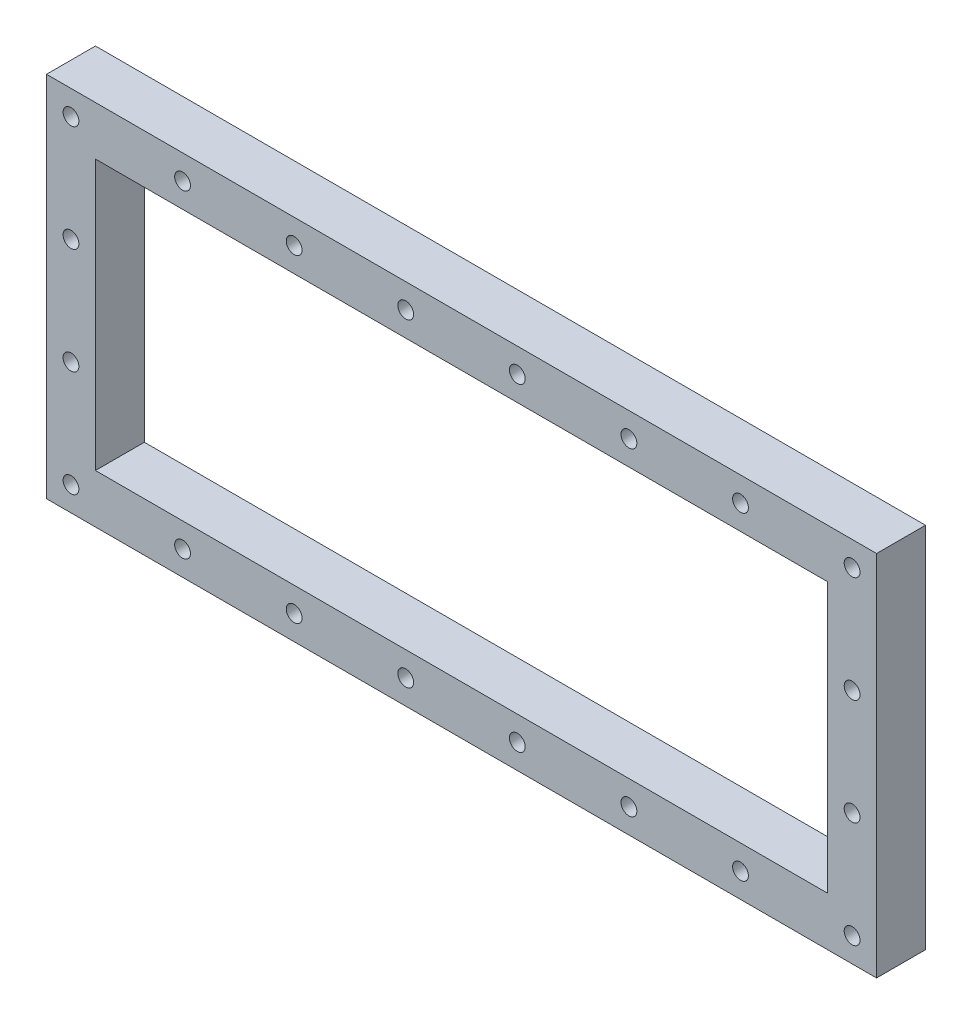
ISO-10303-21;
HEADER;
FILE_DESCRIPTION(('STEP AP214'),'2;1');
FILE_NAME('part.step','',(''),(''),'','','');
FILE_SCHEMA(('AUTOMOTIVE_DESIGN { 1 0 10303 214 1 1 1 1 }'));
ENDSEC;
DATA;
#1=APPLICATION_CONTEXT('core data for automotive mechanical design processes');
#2=APPLICATION_PROTOCOL_DEFINITION('international standard','automotive_design',2000,#1);
#3=PRODUCT_CONTEXT('',#1,'mechanical');
#4=PRODUCT('Part','Part','',(#3));
#5=PRODUCT_RELATED_PRODUCT_CATEGORY('part','',(#4));
#6=PRODUCT_DEFINITION_FORMATION('','',#4);
#7=PRODUCT_DEFINITION_CONTEXT('part definition',#1,'design');
#8=PRODUCT_DEFINITION('design','',#6,#7);
#9=PRODUCT_DEFINITION_SHAPE('','',#8);
#10=(LENGTH_UNIT() NAMED_UNIT(*) SI_UNIT(.MILLI.,.METRE.));
#11=(NAMED_UNIT(*) PLANE_ANGLE_UNIT() SI_UNIT($,.RADIAN.));
#12=(NAMED_UNIT(*) SI_UNIT($,.STERADIAN.) SOLID_ANGLE_UNIT());
#13=UNCERTAINTY_MEASURE_WITH_UNIT(LENGTH_MEASURE(1.E-05),#10,'distance_accuracy_value','');
#14=(GEOMETRIC_REPRESENTATION_CONTEXT(3) GLOBAL_UNCERTAINTY_ASSIGNED_CONTEXT((#13)) GLOBAL_UNIT_ASSIGNED_CONTEXT((#10,
#11,#12)) REPRESENTATION_CONTEXT('',''));
#15=CARTESIAN_POINT('',(0.,0.,0.));
#16=DIRECTION('',(0.,0.,1.));
#17=DIRECTION('',(1.,0.,0.));
#18=AXIS2_PLACEMENT_3D('',#15,#16,#17);
#19=CARTESIAN_POINT('',(0.,17.5,6.35));
#20=DIRECTION('',(0.,1.,0.));
#21=DIRECTION('',(0.,0.,1.));
#22=AXIS2_PLACEMENT_3D('',#19,#20,#21);
#23=PLANE('',#22);
#24=DIRECTION('',(1.,0.,0.));
#25=VECTOR('',#24,1.);
#26=CARTESIAN_POINT('',(0.,17.5,0.));
#27=LINE('',#26,#25);
#28=CARTESIAN_POINT('',(-47.5,17.5,0.));
#29=VERTEX_POINT('',#28);
#30=CARTESIAN_POINT('',(47.5,17.5,0.));
#31=VERTEX_POINT('',#30);
#32=EDGE_CURVE('E243',#29,#31,#27,.T.);
#33=ORIENTED_EDGE('',*,*,#32,.T.);
#34=DIRECTION('',(0.,0.,-1.));
#35=VECTOR('',#34,1.);
#36=CARTESIAN_POINT('',(47.5,17.5,6.35));
#37=LINE('',#36,#35);
#38=CARTESIAN_POINT('',(47.5,17.5,6.35));
#39=VERTEX_POINT('',#38);
#40=EDGE_CURVE('E11',#39,#31,#37,.T.);
#41=ORIENTED_EDGE('',*,*,#40,.F.);
#42=DIRECTION('',(1.,0.,0.));
#43=VECTOR('',#42,1.);
#44=CARTESIAN_POINT('',(0.,17.5,6.35));
#45=LINE('',#44,#43);
#46=CARTESIAN_POINT('',(-47.5,17.5,6.35));
#47=VERTEX_POINT('',#46);
#48=EDGE_CURVE('E126',#47,#39,#45,.T.);
#49=ORIENTED_EDGE('',*,*,#48,.F.);
#50=DIRECTION('',(0.,0.,-1.));
#51=VECTOR('',#50,1.);
#52=CARTESIAN_POINT('',(-47.5,17.5,6.35));
#53=LINE('',#52,#51);
#54=EDGE_CURVE('E65',#47,#29,#53,.T.);
#55=ORIENTED_EDGE('',*,*,#54,.T.);
#56=EDGE_LOOP('',(#33,#41,#49,#55));
#57=FACE_BOUND('',#56,.T.);
#58=ADVANCED_FACE('F45',(#57),#23,.F.);
#59=CARTESIAN_POINT('',(47.5,0.,6.35));
#60=DIRECTION('',(1.,0.,0.));
#61=DIRECTION('',(0.,1.,0.));
#62=AXIS2_PLACEMENT_3D('',#59,#60,#61);
#63=PLANE('',#62);
#64=DIRECTION('',(0.,-1.,0.));
#65=VECTOR('',#64,1.);
#66=CARTESIAN_POINT('',(47.5,0.,0.));
#67=LINE('',#66,#65);
#68=CARTESIAN_POINT('',(47.5,-17.5,0.));
#69=VERTEX_POINT('',#68);
#70=EDGE_CURVE('E133',#31,#69,#67,.T.);
#71=ORIENTED_EDGE('',*,*,#70,.T.);
#72=DIRECTION('',(0.,0.,-1.));
#73=VECTOR('',#72,1.);
#74=CARTESIAN_POINT('',(47.5,-17.5,6.35));
#75=LINE('',#74,#73);
#76=CARTESIAN_POINT('',(47.5,-17.5,6.35));
#77=VERTEX_POINT('',#76);
#78=EDGE_CURVE('E56',#77,#69,#75,.T.);
#79=ORIENTED_EDGE('',*,*,#78,.F.);
#80=DIRECTION('',(0.,-1.,0.));
#81=VECTOR('',#80,1.);
#82=CARTESIAN_POINT('',(47.5,0.,6.35));
#83=LINE('',#82,#81);
#84=EDGE_CURVE('E120',#39,#77,#83,.T.);
#85=ORIENTED_EDGE('',*,*,#84,.F.);
#86=ORIENTED_EDGE('',*,*,#40,.T.);
#87=EDGE_LOOP('',(#71,#79,#85,#86));
#88=FACE_BOUND('',#87,.T.);
#89=ADVANCED_FACE('F132',(#88),#63,.F.);
#90=CARTESIAN_POINT('',(0.,-17.5,6.35));
#91=DIRECTION('',(0.,1.,0.));
#92=DIRECTION('',(0.,0.,1.));
#93=AXIS2_PLACEMENT_3D('',#90,#91,#92);
#94=PLANE('',#93);
#95=DIRECTION('',(1.,0.,0.));
#96=VECTOR('',#95,1.);
#97=CARTESIAN_POINT('',(0.,-17.5,0.));
#98=LINE('',#97,#96);
#99=CARTESIAN_POINT('',(-47.5,-17.5,0.));
#100=VERTEX_POINT('',#99);
#101=EDGE_CURVE('E248',#100,#69,#98,.T.);
#102=ORIENTED_EDGE('',*,*,#101,.F.);
#103=DIRECTION('',(0.,0.,-1.));
#104=VECTOR('',#103,1.);
#105=CARTESIAN_POINT('',(-47.5,-17.5,6.35));
#106=LINE('',#105,#104);
#107=CARTESIAN_POINT('',(-47.5,-17.5,6.35));
#108=VERTEX_POINT('',#107);
#109=EDGE_CURVE('E91',#108,#100,#106,.T.);
#110=ORIENTED_EDGE('',*,*,#109,.F.);
#111=DIRECTION('',(1.,0.,0.));
#112=VECTOR('',#111,1.);
#113=CARTESIAN_POINT('',(0.,-17.5,6.35));
#114=LINE('',#113,#112);
#115=EDGE_CURVE('E125',#108,#77,#114,.T.);
#116=ORIENTED_EDGE('',*,*,#115,.T.);
#117=ORIENTED_EDGE('',*,*,#78,.T.);
#118=EDGE_LOOP('',(#102,#110,#116,#117));
#119=FACE_BOUND('',#118,.T.);
#120=ADVANCED_FACE('F138',(#119),#94,.T.);
#121=CARTESIAN_POINT('',(0.,-23.85,6.35));
#122=DIRECTION('',(0.,1.,0.));
#123=DIRECTION('',(0.,0.,1.));
#124=AXIS2_PLACEMENT_3D('',#121,#122,#123);
#125=PLANE('',#124);
#126=DIRECTION('',(1.,0.,0.));
#127=VECTOR('',#126,1.);
#128=CARTESIAN_POINT('',(0.,-23.85,0.));
#129=LINE('',#128,#127);
#130=CARTESIAN_POINT('',(-53.85,-23.85,0.));
#131=VERTEX_POINT('',#130);
#132=CARTESIAN_POINT('',(53.85,-23.85,0.));
#133=VERTEX_POINT('',#132);
#134=EDGE_CURVE('E227',#131,#133,#129,.T.);
#135=ORIENTED_EDGE('',*,*,#134,.T.);
#136=DIRECTION('',(0.,0.,-1.));
#137=VECTOR('',#136,1.);
#138=CARTESIAN_POINT('',(53.85,-23.85,6.35));
#139=LINE('',#138,#137);
#140=CARTESIAN_POINT('',(53.85,-23.85,6.35));
#141=VERTEX_POINT('',#140);
#142=EDGE_CURVE('E49',#141,#133,#139,.T.);
#143=ORIENTED_EDGE('',*,*,#142,.F.);
#144=DIRECTION('',(1.,0.,0.));
#145=VECTOR('',#144,1.);
#146=CARTESIAN_POINT('',(0.,-23.85,6.35));
#147=LINE('',#146,#145);
#148=CARTESIAN_POINT('',(-53.85,-23.85,6.35));
#149=VERTEX_POINT('',#148);
#150=EDGE_CURVE('E394',#149,#141,#147,.T.);
#151=ORIENTED_EDGE('',*,*,#150,.F.);
#152=DIRECTION('',(0.,0.,-1.));
#153=VECTOR('',#152,1.);
#154=CARTESIAN_POINT('',(-53.85,-23.85,6.35));
#155=LINE('',#154,#153);
#156=EDGE_CURVE('E143',#149,#131,#155,.T.);
#157=ORIENTED_EDGE('',*,*,#156,.T.);
#158=EDGE_LOOP('',(#135,#143,#151,#157));
#159=FACE_BOUND('',#158,.T.);
#160=ADVANCED_FACE('F275',(#159),#125,.F.);
#161=CARTESIAN_POINT('',(53.85,0.,6.35));
#162=DIRECTION('',(-1.,0.,0.));
#163=DIRECTION('',(0.,0.,1.));
#164=AXIS2_PLACEMENT_3D('',#161,#162,#163);
#165=PLANE('',#164);
#166=DIRECTION('',(0.,1.,0.));
#167=VECTOR('',#166,1.);
#168=CARTESIAN_POINT('',(53.85,0.,0.));
#169=LINE('',#168,#167);
#170=CARTESIAN_POINT('',(53.85,23.85,0.));
#171=VERTEX_POINT('',#170);
#172=EDGE_CURVE('E231',#133,#171,#169,.T.);
#173=ORIENTED_EDGE('',*,*,#172,.T.);
#174=DIRECTION('',(0.,0.,-1.));
#175=VECTOR('',#174,1.);
#176=CARTESIAN_POINT('',(53.85,23.85,6.35));
#177=LINE('',#176,#175);
#178=CARTESIAN_POINT('',(53.85,23.85,6.35));
#179=VERTEX_POINT('',#178);
#180=EDGE_CURVE('E264',#179,#171,#177,.T.);
#181=ORIENTED_EDGE('',*,*,#180,.F.);
#182=DIRECTION('',(0.,1.,0.));
#183=VECTOR('',#182,1.);
#184=CARTESIAN_POINT('',(53.85,0.,6.35));
#185=LINE('',#184,#183);
#186=EDGE_CURVE('E104',#141,#179,#185,.T.);
#187=ORIENTED_EDGE('',*,*,#186,.F.);
#188=ORIENTED_EDGE('',*,*,#142,.T.);
#189=EDGE_LOOP('',(#173,#181,#187,#188));
#190=FACE_BOUND('',#189,.T.);
#191=ADVANCED_FACE('F271',(#190),#165,.F.);
#192=CARTESIAN_POINT('',(0.,23.85,6.35));
#193=DIRECTION('',(0.,1.,0.));
#194=DIRECTION('',(0.,0.,1.));
#195=AXIS2_PLACEMENT_3D('',#192,#193,#194);
#196=PLANE('',#195);
#197=DIRECTION('',(1.,0.,0.));
#198=VECTOR('',#197,1.);
#199=CARTESIAN_POINT('',(0.,23.85,0.));
#200=LINE('',#199,#198);
#201=CARTESIAN_POINT('',(-53.85,23.85,0.));
#202=VERTEX_POINT('',#201);
#203=EDGE_CURVE('E235',#202,#171,#200,.T.);
#204=ORIENTED_EDGE('',*,*,#203,.F.);
#205=DIRECTION('',(0.,0.,-1.));
#206=VECTOR('',#205,1.);
#207=CARTESIAN_POINT('',(-53.85,23.85,6.35));
#208=LINE('',#207,#206);
#209=CARTESIAN_POINT('',(-53.85,23.85,6.35));
#210=VERTEX_POINT('',#209);
#211=EDGE_CURVE('E262',#210,#202,#208,.T.);
#212=ORIENTED_EDGE('',*,*,#211,.F.);
#213=DIRECTION('',(1.,0.,0.));
#214=VECTOR('',#213,1.);
#215=CARTESIAN_POINT('',(0.,23.85,6.35));
#216=LINE('',#215,#214);
#217=EDGE_CURVE('E399',#210,#179,#216,.T.);
#218=ORIENTED_EDGE('',*,*,#217,.T.);
#219=ORIENTED_EDGE('',*,*,#180,.T.);
#220=EDGE_LOOP('',(#204,#212,#218,#219));
#221=FACE_BOUND('',#220,.T.);
#222=ADVANCED_FACE('F286',(#221),#196,.T.);
#223=CARTESIAN_POINT('',(-53.85,0.,6.35));
#224=DIRECTION('',(-1.,0.,0.));
#225=DIRECTION('',(0.,0.,1.));
#226=AXIS2_PLACEMENT_3D('',#223,#224,#225);
#227=PLANE('',#226);
#228=DIRECTION('',(0.,1.,0.));
#229=VECTOR('',#228,1.);
#230=CARTESIAN_POINT('',(-53.85,0.,0.));
#231=LINE('',#230,#229);
#232=EDGE_CURVE('E239',#131,#202,#231,.T.);
#233=ORIENTED_EDGE('',*,*,#232,.F.);
#234=ORIENTED_EDGE('',*,*,#156,.F.);
#235=DIRECTION('',(0.,1.,0.));
#236=VECTOR('',#235,1.);
#237=CARTESIAN_POINT('',(-53.85,0.,6.35));
#238=LINE('',#237,#236);
#239=EDGE_CURVE('E284',#149,#210,#238,.T.);
#240=ORIENTED_EDGE('',*,*,#239,.T.);
#241=ORIENTED_EDGE('',*,*,#211,.T.);
#242=EDGE_LOOP('',(#233,#234,#240,#241));
#243=FACE_BOUND('',#242,.T.);
#244=ADVANCED_FACE('F281',(#243),#227,.T.);
#245=CARTESIAN_POINT('',(-50.675,20.675,6.35));
#246=DIRECTION('',(0.,0.,-1.));
#247=DIRECTION('',(-1.,0.,0.));
#248=AXIS2_PLACEMENT_3D('',#245,#246,#247);
#249=CYLINDRICAL_SURFACE('',#248,1.025);
#250=CARTESIAN_POINT('',(-50.675,20.675,6.35));
#251=DIRECTION('',(0.,0.,1.));
#252=DIRECTION('',(1.,0.,0.));
#253=AXIS2_PLACEMENT_3D('',#250,#251,#252);
#254=CIRCLE('',#253,1.025);
#255=CARTESIAN_POINT('',(-49.65,20.675,6.35));
#256=VERTEX_POINT('',#255);
#257=EDGE_CURVE('E393',#256,#256,#254,.T.);
#258=ORIENTED_EDGE('',*,*,#257,.T.);
#259=EDGE_LOOP('',(#258));
#260=FACE_BOUND('',#259,.T.);
#261=CARTESIAN_POINT('',(-50.675,20.675,0.));
#262=DIRECTION('',(0.,0.,1.));
#263=DIRECTION('',(1.,0.,0.));
#264=AXIS2_PLACEMENT_3D('',#261,#262,#263);
#265=CIRCLE('',#264,1.025);
#266=CARTESIAN_POINT('',(-49.65,20.675,0.));
#267=VERTEX_POINT('',#266);
#268=EDGE_CURVE('E223',#267,#267,#265,.T.);
#269=ORIENTED_EDGE('',*,*,#268,.F.);
#270=EDGE_LOOP('',(#269));
#271=FACE_BOUND('',#270,.T.);
#272=ADVANCED_FACE('F293',(#260,#271),#249,.F.);
#273=CARTESIAN_POINT('',(50.675,20.675,6.35));
#274=DIRECTION('',(0.,0.,-1.));
#275=DIRECTION('',(-1.,0.,0.));
#276=AXIS2_PLACEMENT_3D('',#273,#274,#275);
#277=CYLINDRICAL_SURFACE('',#276,1.025);
#278=CARTESIAN_POINT('',(50.675,20.675,6.35));
#279=DIRECTION('',(0.,0.,1.));
#280=DIRECTION('',(1.,0.,0.));
#281=AXIS2_PLACEMENT_3D('',#278,#279,#280);
#282=CIRCLE('',#281,1.025);
#283=CARTESIAN_POINT('',(51.7,20.675,6.35));
#284=VERTEX_POINT('',#283);
#285=EDGE_CURVE('E389',#284,#284,#282,.T.);
#286=ORIENTED_EDGE('',*,*,#285,.T.);
#287=EDGE_LOOP('',(#286));
#288=FACE_BOUND('',#287,.T.);
#289=CARTESIAN_POINT('',(50.675,20.675,0.));
#290=DIRECTION('',(0.,0.,1.));
#291=DIRECTION('',(1.,0.,0.));
#292=AXIS2_PLACEMENT_3D('',#289,#290,#291);
#293=CIRCLE('',#292,1.025);
#294=CARTESIAN_POINT('',(51.7,20.675,0.));
#295=VERTEX_POINT('',#294);
#296=EDGE_CURVE('E219',#295,#295,#293,.T.);
#297=ORIENTED_EDGE('',*,*,#296,.F.);
#298=EDGE_LOOP('',(#297));
#299=FACE_BOUND('',#298,.T.);
#300=ADVANCED_FACE('F490',(#288,#299),#277,.F.);
#301=CARTESIAN_POINT('',(-50.675,-20.675,6.35));
#302=DIRECTION('',(0.,0.,-1.));
#303=DIRECTION('',(-1.,0.,0.));
#304=AXIS2_PLACEMENT_3D('',#301,#302,#303);
#305=CYLINDRICAL_SURFACE('',#304,1.025);
#306=CARTESIAN_POINT('',(-50.675,-20.675,6.35));
#307=DIRECTION('',(0.,0.,1.));
#308=DIRECTION('',(1.,0.,0.));
#309=AXIS2_PLACEMENT_3D('',#306,#307,#308);
#310=CIRCLE('',#309,1.025);
#311=CARTESIAN_POINT('',(-49.65,-20.675,6.35));
#312=VERTEX_POINT('',#311);
#313=EDGE_CURVE('E385',#312,#312,#310,.T.);
#314=ORIENTED_EDGE('',*,*,#313,.T.);
#315=EDGE_LOOP('',(#314));
#316=FACE_BOUND('',#315,.T.);
#317=CARTESIAN_POINT('',(-50.675,-20.675,0.));
#318=DIRECTION('',(0.,0.,1.));
#319=DIRECTION('',(1.,0.,0.));
#320=AXIS2_PLACEMENT_3D('',#317,#318,#319);
#321=CIRCLE('',#320,1.025);
#322=CARTESIAN_POINT('',(-49.65,-20.675,0.));
#323=VERTEX_POINT('',#322);
#324=EDGE_CURVE('E215',#323,#323,#321,.T.);
#325=ORIENTED_EDGE('',*,*,#324,.F.);
#326=EDGE_LOOP('',(#325));
#327=FACE_BOUND('',#326,.T.);
#328=ADVANCED_FACE('F496',(#316,#327),#305,.F.);
#329=CARTESIAN_POINT('',(50.675,-20.675,6.35));
#330=DIRECTION('',(0.,0.,-1.));
#331=DIRECTION('',(-1.,0.,0.));
#332=AXIS2_PLACEMENT_3D('',#329,#330,#331);
#333=CYLINDRICAL_SURFACE('',#332,1.025);
#334=CARTESIAN_POINT('',(50.675,-20.675,6.35));
#335=DIRECTION('',(0.,0.,1.));
#336=DIRECTION('',(1.,0.,0.));
#337=AXIS2_PLACEMENT_3D('',#334,#335,#336);
#338=CIRCLE('',#337,1.025);
#339=CARTESIAN_POINT('',(51.7,-20.675,6.35));
#340=VERTEX_POINT('',#339);
#341=EDGE_CURVE('E381',#340,#340,#338,.T.);
#342=ORIENTED_EDGE('',*,*,#341,.T.);
#343=EDGE_LOOP('',(#342));
#344=FACE_BOUND('',#343,.T.);
#345=CARTESIAN_POINT('',(50.675,-20.675,0.));
#346=DIRECTION('',(0.,0.,1.));
#347=DIRECTION('',(1.,0.,0.));
#348=AXIS2_PLACEMENT_3D('',#345,#346,#347);
#349=CIRCLE('',#348,1.025);
#350=CARTESIAN_POINT('',(51.7,-20.675,0.));
#351=VERTEX_POINT('',#350);
#352=EDGE_CURVE('E211',#351,#351,#349,.T.);
#353=ORIENTED_EDGE('',*,*,#352,.F.);
#354=EDGE_LOOP('',(#353));
#355=FACE_BOUND('',#354,.T.);
#356=ADVANCED_FACE('F503',(#344,#355),#333,.F.);
#357=CARTESIAN_POINT('',(-7.2392857142,20.675,6.35));
#358=DIRECTION('',(0.,0.,-1.));
#359=DIRECTION('',(-1.,0.,0.));
#360=AXIS2_PLACEMENT_3D('',#357,#358,#359);
#361=CYLINDRICAL_SURFACE('',#360,1.025);
#362=CARTESIAN_POINT('',(-7.2392857142,20.675,6.35));
#363=DIRECTION('',(0.,0.,1.));
#364=DIRECTION('',(1.,0.,0.));
#365=AXIS2_PLACEMENT_3D('',#362,#363,#364);
#366=CIRCLE('',#365,1.025);
#367=CARTESIAN_POINT('',(-6.2142857142,20.675,6.35));
#368=VERTEX_POINT('',#367);
#369=EDGE_CURVE('E377',#368,#368,#366,.T.);
#370=ORIENTED_EDGE('',*,*,#369,.T.);
#371=EDGE_LOOP('',(#370));
#372=FACE_BOUND('',#371,.T.);
#373=CARTESIAN_POINT('',(-7.2392857142,20.675,0.));
#374=DIRECTION('',(0.,0.,1.));
#375=DIRECTION('',(1.,0.,0.));
#376=AXIS2_PLACEMENT_3D('',#373,#374,#375);
#377=CIRCLE('',#376,1.025);
#378=CARTESIAN_POINT('',(-6.2142857142,20.675,0.));
#379=VERTEX_POINT('',#378);
#380=EDGE_CURVE('E207',#379,#379,#377,.T.);
#381=ORIENTED_EDGE('',*,*,#380,.F.);
#382=EDGE_LOOP('',(#381));
#383=FACE_BOUND('',#382,.T.);
#384=ADVANCED_FACE('F507',(#372,#383),#361,.F.);
#385=CARTESIAN_POINT('',(-7.2392857142,-20.675,6.35));
#386=DIRECTION('',(0.,0.,-1.));
#387=DIRECTION('',(-1.,0.,0.));
#388=AXIS2_PLACEMENT_3D('',#385,#386,#387);
#389=CYLINDRICAL_SURFACE('',#388,1.025);
#390=CARTESIAN_POINT('',(-7.2392857142,-20.675,6.35));
#391=DIRECTION('',(0.,0.,1.));
#392=DIRECTION('',(1.,0.,0.));
#393=AXIS2_PLACEMENT_3D('',#390,#391,#392);
#394=CIRCLE('',#393,1.025);
#395=CARTESIAN_POINT('',(-6.2142857142,-20.675,6.35));
#396=VERTEX_POINT('',#395);
#397=EDGE_CURVE('E373',#396,#396,#394,.T.);
#398=ORIENTED_EDGE('',*,*,#397,.T.);
#399=EDGE_LOOP('',(#398));
#400=FACE_BOUND('',#399,.T.);
#401=CARTESIAN_POINT('',(-7.2392857142,-20.675,0.));
#402=DIRECTION('',(0.,0.,1.));
#403=DIRECTION('',(1.,0.,0.));
#404=AXIS2_PLACEMENT_3D('',#401,#402,#403);
#405=CIRCLE('',#404,1.025);
#406=CARTESIAN_POINT('',(-6.2142857142,-20.675,0.));
#407=VERTEX_POINT('',#406);
#408=EDGE_CURVE('E203',#407,#407,#405,.T.);
#409=ORIENTED_EDGE('',*,*,#408,.F.);
#410=EDGE_LOOP('',(#409));
#411=FACE_BOUND('',#410,.T.);
#412=ADVANCED_FACE('F511',(#400,#411),#389,.F.);
#413=CARTESIAN_POINT('',(-36.1964285714,20.675,6.35));
#414=DIRECTION('',(0.,0.,-1.));
#415=DIRECTION('',(-1.,0.,0.));
#416=AXIS2_PLACEMENT_3D('',#413,#414,#415);
#417=CYLINDRICAL_SURFACE('',#416,1.025);
#418=CARTESIAN_POINT('',(-36.1964285714,20.675,6.35));
#419=DIRECTION('',(0.,0.,1.));
#420=DIRECTION('',(1.,0.,0.));
#421=AXIS2_PLACEMENT_3D('',#418,#419,#420);
#422=CIRCLE('',#421,1.025);
#423=CARTESIAN_POINT('',(-35.1714285714,20.675,6.35));
#424=VERTEX_POINT('',#423);
#425=EDGE_CURVE('E369',#424,#424,#422,.T.);
#426=ORIENTED_EDGE('',*,*,#425,.T.);
#427=EDGE_LOOP('',(#426));
#428=FACE_BOUND('',#427,.T.);
#429=CARTESIAN_POINT('',(-36.1964285714,20.675,0.));
#430=DIRECTION('',(0.,0.,1.));
#431=DIRECTION('',(1.,0.,0.));
#432=AXIS2_PLACEMENT_3D('',#429,#430,#431);
#433=CIRCLE('',#432,1.025);
#434=CARTESIAN_POINT('',(-35.1714285714,20.675,0.));
#435=VERTEX_POINT('',#434);
#436=EDGE_CURVE('E199',#435,#435,#433,.T.);
#437=ORIENTED_EDGE('',*,*,#436,.F.);
#438=EDGE_LOOP('',(#437));
#439=FACE_BOUND('',#438,.T.);
#440=ADVANCED_FACE('F515',(#428,#439),#417,.F.);
#441=CARTESIAN_POINT('',(-21.7178571428,20.675,6.35));
#442=DIRECTION('',(0.,0.,-1.));
#443=DIRECTION('',(-1.,0.,0.));
#444=AXIS2_PLACEMENT_3D('',#441,#442,#443);
#445=CYLINDRICAL_SURFACE('',#444,1.025);
#446=CARTESIAN_POINT('',(-21.7178571428,20.675,6.35));
#447=DIRECTION('',(0.,0.,1.));
#448=DIRECTION('',(1.,0.,0.));
#449=AXIS2_PLACEMENT_3D('',#446,#447,#448);
#450=CIRCLE('',#449,1.025);
#451=CARTESIAN_POINT('',(-20.6928571428,20.675,6.35));
#452=VERTEX_POINT('',#451);
#453=EDGE_CURVE('E365',#452,#452,#450,.T.);
#454=ORIENTED_EDGE('',*,*,#453,.T.);
#455=EDGE_LOOP('',(#454));
#456=FACE_BOUND('',#455,.T.);
#457=CARTESIAN_POINT('',(-21.7178571428,20.675,0.));
#458=DIRECTION('',(0.,0.,1.));
#459=DIRECTION('',(1.,0.,0.));
#460=AXIS2_PLACEMENT_3D('',#457,#458,#459);
#461=CIRCLE('',#460,1.025);
#462=CARTESIAN_POINT('',(-20.6928571428,20.675,0.));
#463=VERTEX_POINT('',#462);
#464=EDGE_CURVE('E195',#463,#463,#461,.T.);
#465=ORIENTED_EDGE('',*,*,#464,.F.);
#466=EDGE_LOOP('',(#465));
#467=FACE_BOUND('',#466,.T.);
#468=ADVANCED_FACE('F519',(#456,#467),#445,.F.);
#469=CARTESIAN_POINT('',(7.2392857144,20.675,6.35));
#470=DIRECTION('',(0.,0.,-1.));
#471=DIRECTION('',(-1.,0.,0.));
#472=AXIS2_PLACEMENT_3D('',#469,#470,#471);
#473=CYLINDRICAL_SURFACE('',#472,1.025);
#474=CARTESIAN_POINT('',(7.2392857144,20.675,6.35));
#475=DIRECTION('',(0.,0.,1.));
#476=DIRECTION('',(1.,0.,0.));
#477=AXIS2_PLACEMENT_3D('',#474,#475,#476);
#478=CIRCLE('',#477,1.025);
#479=CARTESIAN_POINT('',(8.2642857144,20.675,6.35));
#480=VERTEX_POINT('',#479);
#481=EDGE_CURVE('E361',#480,#480,#478,.T.);
#482=ORIENTED_EDGE('',*,*,#481,.T.);
#483=EDGE_LOOP('',(#482));
#484=FACE_BOUND('',#483,.T.);
#485=CARTESIAN_POINT('',(7.2392857144,20.675,0.));
#486=DIRECTION('',(0.,0.,1.));
#487=DIRECTION('',(1.,0.,0.));
#488=AXIS2_PLACEMENT_3D('',#485,#486,#487);
#489=CIRCLE('',#488,1.025);
#490=CARTESIAN_POINT('',(8.2642857144,20.675,0.));
#491=VERTEX_POINT('',#490);
#492=EDGE_CURVE('E191',#491,#491,#489,.T.);
#493=ORIENTED_EDGE('',*,*,#492,.F.);
#494=EDGE_LOOP('',(#493));
#495=FACE_BOUND('',#494,.T.);
#496=ADVANCED_FACE('F523',(#484,#495),#473,.F.);
#497=CARTESIAN_POINT('',(21.717857143,20.675,6.35));
#498=DIRECTION('',(0.,0.,-1.));
#499=DIRECTION('',(-1.,0.,0.));
#500=AXIS2_PLACEMENT_3D('',#497,#498,#499);
#501=CYLINDRICAL_SURFACE('',#500,1.025);
#502=CARTESIAN_POINT('',(21.717857143,20.675,6.35));
#503=DIRECTION('',(0.,0.,1.));
#504=DIRECTION('',(1.,0.,0.));
#505=AXIS2_PLACEMENT_3D('',#502,#503,#504);
#506=CIRCLE('',#505,1.025);
#507=CARTESIAN_POINT('',(22.742857143,20.675,6.35));
#508=VERTEX_POINT('',#507);
#509=EDGE_CURVE('E357',#508,#508,#506,.T.);
#510=ORIENTED_EDGE('',*,*,#509,.T.);
#511=EDGE_LOOP('',(#510));
#512=FACE_BOUND('',#511,.T.);
#513=CARTESIAN_POINT('',(21.717857143,20.675,0.));
#514=DIRECTION('',(0.,0.,1.));
#515=DIRECTION('',(1.,0.,0.));
#516=AXIS2_PLACEMENT_3D('',#513,#514,#515);
#517=CIRCLE('',#516,1.025);
#518=CARTESIAN_POINT('',(22.742857143,20.675,0.));
#519=VERTEX_POINT('',#518);
#520=EDGE_CURVE('E187',#519,#519,#517,.T.);
#521=ORIENTED_EDGE('',*,*,#520,.F.);
#522=EDGE_LOOP('',(#521));
#523=FACE_BOUND('',#522,.T.);
#524=ADVANCED_FACE('F527',(#512,#523),#501,.F.);
#525=CARTESIAN_POINT('',(-50.675,6.89166670000001,6.35));
#526=DIRECTION('',(0.,0.,-1.));
#527=DIRECTION('',(-1.,0.,0.));
#528=AXIS2_PLACEMENT_3D('',#525,#526,#527);
#529=CYLINDRICAL_SURFACE('',#528,1.025);
#530=CARTESIAN_POINT('',(-50.675,6.89166670000001,6.35));
#531=DIRECTION('',(0.,0.,1.));
#532=DIRECTION('',(1.,0.,0.));
#533=AXIS2_PLACEMENT_3D('',#530,#531,#532);
#534=CIRCLE('',#533,1.025);
#535=CARTESIAN_POINT('',(-49.65,6.89166670000001,6.35));
#536=VERTEX_POINT('',#535);
#537=EDGE_CURVE('E353',#536,#536,#534,.T.);
#538=ORIENTED_EDGE('',*,*,#537,.T.);
#539=EDGE_LOOP('',(#538));
#540=FACE_BOUND('',#539,.T.);
#541=CARTESIAN_POINT('',(-50.675,6.89166670000001,0.));
#542=DIRECTION('',(0.,0.,1.));
#543=DIRECTION('',(1.,0.,0.));
#544=AXIS2_PLACEMENT_3D('',#541,#542,#543);
#545=CIRCLE('',#544,1.025);
#546=CARTESIAN_POINT('',(-49.65,6.89166670000001,0.));
#547=VERTEX_POINT('',#546);
#548=EDGE_CURVE('E183',#547,#547,#545,.T.);
#549=ORIENTED_EDGE('',*,*,#548,.F.);
#550=EDGE_LOOP('',(#549));
#551=FACE_BOUND('',#550,.T.);
#552=ADVANCED_FACE('F531',(#540,#551),#529,.F.);
#553=CARTESIAN_POINT('',(-50.675,-6.8916667,6.35));
#554=DIRECTION('',(0.,0.,-1.));
#555=DIRECTION('',(-1.,0.,0.));
#556=AXIS2_PLACEMENT_3D('',#553,#554,#555);
#557=CYLINDRICAL_SURFACE('',#556,1.025);
#558=CARTESIAN_POINT('',(-50.675,-6.8916667,6.35));
#559=DIRECTION('',(0.,0.,1.));
#560=DIRECTION('',(1.,0.,0.));
#561=AXIS2_PLACEMENT_3D('',#558,#559,#560);
#562=CIRCLE('',#561,1.025);
#563=CARTESIAN_POINT('',(-49.65,-6.8916667,6.35));
#564=VERTEX_POINT('',#563);
#565=EDGE_CURVE('E349',#564,#564,#562,.T.);
#566=ORIENTED_EDGE('',*,*,#565,.T.);
#567=EDGE_LOOP('',(#566));
#568=FACE_BOUND('',#567,.T.);
#569=CARTESIAN_POINT('',(-50.675,-6.8916667,0.));
#570=DIRECTION('',(0.,0.,1.));
#571=DIRECTION('',(1.,0.,0.));
#572=AXIS2_PLACEMENT_3D('',#569,#570,#571);
#573=CIRCLE('',#572,1.025);
#574=CARTESIAN_POINT('',(-49.65,-6.8916667,0.));
#575=VERTEX_POINT('',#574);
#576=EDGE_CURVE('E179',#575,#575,#573,.T.);
#577=ORIENTED_EDGE('',*,*,#576,.F.);
#578=EDGE_LOOP('',(#577));
#579=FACE_BOUND('',#578,.T.);
#580=ADVANCED_FACE('F535',(#568,#579),#557,.F.);
#581=CARTESIAN_POINT('',(50.675,6.89166670000002,6.35));
#582=DIRECTION('',(0.,0.,-1.));
#583=DIRECTION('',(-1.,0.,0.));
#584=AXIS2_PLACEMENT_3D('',#581,#582,#583);
#585=CYLINDRICAL_SURFACE('',#584,1.025);
#586=CARTESIAN_POINT('',(50.675,6.89166670000002,6.35));
#587=DIRECTION('',(0.,0.,1.));
#588=DIRECTION('',(1.,0.,0.));
#589=AXIS2_PLACEMENT_3D('',#586,#587,#588);
#590=CIRCLE('',#589,1.025);
#591=CARTESIAN_POINT('',(51.7,6.89166670000002,6.35));
#592=VERTEX_POINT('',#591);
#593=EDGE_CURVE('E345',#592,#592,#590,.T.);
#594=ORIENTED_EDGE('',*,*,#593,.T.);
#595=EDGE_LOOP('',(#594));
#596=FACE_BOUND('',#595,.T.);
#597=CARTESIAN_POINT('',(50.675,6.89166670000002,0.));
#598=DIRECTION('',(0.,0.,1.));
#599=DIRECTION('',(1.,0.,0.));
#600=AXIS2_PLACEMENT_3D('',#597,#598,#599);
#601=CIRCLE('',#600,1.025);
#602=CARTESIAN_POINT('',(51.7,6.89166670000002,0.));
#603=VERTEX_POINT('',#602);
#604=EDGE_CURVE('E175',#603,#603,#601,.T.);
#605=ORIENTED_EDGE('',*,*,#604,.F.);
#606=EDGE_LOOP('',(#605));
#607=FACE_BOUND('',#606,.T.);
#608=ADVANCED_FACE('F539',(#596,#607),#585,.F.);
#609=CARTESIAN_POINT('',(50.675,-6.89166669999998,6.35));
#610=DIRECTION('',(0.,0.,-1.));
#611=DIRECTION('',(-1.,0.,0.));
#612=AXIS2_PLACEMENT_3D('',#609,#610,#611);
#613=CYLINDRICAL_SURFACE('',#612,1.025);
#614=CARTESIAN_POINT('',(50.675,-6.89166669999998,6.35));
#615=DIRECTION('',(0.,0.,1.));
#616=DIRECTION('',(1.,0.,0.));
#617=AXIS2_PLACEMENT_3D('',#614,#615,#616);
#618=CIRCLE('',#617,1.025);
#619=CARTESIAN_POINT('',(51.7,-6.89166669999998,6.35));
#620=VERTEX_POINT('',#619);
#621=EDGE_CURVE('E341',#620,#620,#618,.T.);
#622=ORIENTED_EDGE('',*,*,#621,.T.);
#623=EDGE_LOOP('',(#622));
#624=FACE_BOUND('',#623,.T.);
#625=CARTESIAN_POINT('',(50.675,-6.89166669999998,0.));
#626=DIRECTION('',(0.,0.,1.));
#627=DIRECTION('',(1.,0.,0.));
#628=AXIS2_PLACEMENT_3D('',#625,#626,#627);
#629=CIRCLE('',#628,1.025);
#630=CARTESIAN_POINT('',(51.7,-6.89166669999998,0.));
#631=VERTEX_POINT('',#630);
#632=EDGE_CURVE('E171',#631,#631,#629,.T.);
#633=ORIENTED_EDGE('',*,*,#632,.F.);
#634=EDGE_LOOP('',(#633));
#635=FACE_BOUND('',#634,.T.);
#636=ADVANCED_FACE('F543',(#624,#635),#613,.F.);
#637=CARTESIAN_POINT('',(7.2392857144,-20.675,6.35));
#638=DIRECTION('',(0.,0.,-1.));
#639=DIRECTION('',(-1.,0.,0.));
#640=AXIS2_PLACEMENT_3D('',#637,#638,#639);
#641=CYLINDRICAL_SURFACE('',#640,1.025);
#642=CARTESIAN_POINT('',(7.2392857144,-20.675,6.35));
#643=DIRECTION('',(0.,0.,1.));
#644=DIRECTION('',(1.,0.,0.));
#645=AXIS2_PLACEMENT_3D('',#642,#643,#644);
#646=CIRCLE('',#645,1.025);
#647=CARTESIAN_POINT('',(8.2642857144,-20.675,6.35));
#648=VERTEX_POINT('',#647);
#649=EDGE_CURVE('E337',#648,#648,#646,.T.);
#650=ORIENTED_EDGE('',*,*,#649,.T.);
#651=EDGE_LOOP('',(#650));
#652=FACE_BOUND('',#651,.T.);
#653=CARTESIAN_POINT('',(7.2392857144,-20.675,0.));
#654=DIRECTION('',(0.,0.,1.));
#655=DIRECTION('',(1.,0.,0.));
#656=AXIS2_PLACEMENT_3D('',#653,#654,#655);
#657=CIRCLE('',#656,1.025);
#658=CARTESIAN_POINT('',(8.2642857144,-20.675,0.));
#659=VERTEX_POINT('',#658);
#660=EDGE_CURVE('E167',#659,#659,#657,.T.);
#661=ORIENTED_EDGE('',*,*,#660,.F.);
#662=EDGE_LOOP('',(#661));
#663=FACE_BOUND('',#662,.T.);
#664=ADVANCED_FACE('F547',(#652,#663),#641,.F.);
#665=CARTESIAN_POINT('',(21.717857143,-20.675,6.35));
#666=DIRECTION('',(0.,0.,-1.));
#667=DIRECTION('',(-1.,0.,0.));
#668=AXIS2_PLACEMENT_3D('',#665,#666,#667);
#669=CYLINDRICAL_SURFACE('',#668,1.025);
#670=CARTESIAN_POINT('',(21.717857143,-20.675,6.35));
#671=DIRECTION('',(0.,0.,1.));
#672=DIRECTION('',(1.,0.,0.));
#673=AXIS2_PLACEMENT_3D('',#670,#671,#672);
#674=CIRCLE('',#673,1.025);
#675=CARTESIAN_POINT('',(22.742857143,-20.675,6.35));
#676=VERTEX_POINT('',#675);
#677=EDGE_CURVE('E333',#676,#676,#674,.T.);
#678=ORIENTED_EDGE('',*,*,#677,.T.);
#679=EDGE_LOOP('',(#678));
#680=FACE_BOUND('',#679,.T.);
#681=CARTESIAN_POINT('',(21.717857143,-20.675,0.));
#682=DIRECTION('',(0.,0.,1.));
#683=DIRECTION('',(1.,0.,0.));
#684=AXIS2_PLACEMENT_3D('',#681,#682,#683);
#685=CIRCLE('',#684,1.025);
#686=CARTESIAN_POINT('',(22.742857143,-20.675,0.));
#687=VERTEX_POINT('',#686);
#688=EDGE_CURVE('E163',#687,#687,#685,.T.);
#689=ORIENTED_EDGE('',*,*,#688,.F.);
#690=EDGE_LOOP('',(#689));
#691=FACE_BOUND('',#690,.T.);
#692=ADVANCED_FACE('F551',(#680,#691),#669,.F.);
#693=CARTESIAN_POINT('',(-21.7178571428,-20.675,6.35));
#694=DIRECTION('',(0.,0.,-1.));
#695=DIRECTION('',(-1.,0.,0.));
#696=AXIS2_PLACEMENT_3D('',#693,#694,#695);
#697=CYLINDRICAL_SURFACE('',#696,1.02499999999999);
#698=CARTESIAN_POINT('',(-21.7178571428,-20.675,6.35));
#699=DIRECTION('',(0.,0.,1.));
#700=DIRECTION('',(1.,0.,0.));
#701=AXIS2_PLACEMENT_3D('',#698,#699,#700);
#702=CIRCLE('',#701,1.02499999999999);
#703=CARTESIAN_POINT('',(-20.6928571428,-20.675,6.35));
#704=VERTEX_POINT('',#703);
#705=EDGE_CURVE('E329',#704,#704,#702,.T.);
#706=ORIENTED_EDGE('',*,*,#705,.T.);
#707=EDGE_LOOP('',(#706));
#708=FACE_BOUND('',#707,.T.);
#709=CARTESIAN_POINT('',(-21.7178571428,-20.675,0.));
#710=DIRECTION('',(0.,0.,1.));
#711=DIRECTION('',(1.,0.,0.));
#712=AXIS2_PLACEMENT_3D('',#709,#710,#711);
#713=CIRCLE('',#712,1.02499999999999);
#714=CARTESIAN_POINT('',(-20.6928571428,-20.675,0.));
#715=VERTEX_POINT('',#714);
#716=EDGE_CURVE('E159',#715,#715,#713,.T.);
#717=ORIENTED_EDGE('',*,*,#716,.F.);
#718=EDGE_LOOP('',(#717));
#719=FACE_BOUND('',#718,.T.);
#720=ADVANCED_FACE('F555',(#708,#719),#697,.F.);
#721=CARTESIAN_POINT('',(-36.1964285714,-20.675,6.35));
#722=DIRECTION('',(0.,0.,-1.));
#723=DIRECTION('',(-1.,0.,0.));
#724=AXIS2_PLACEMENT_3D('',#721,#722,#723);
#725=CYLINDRICAL_SURFACE('',#724,1.025);
#726=CARTESIAN_POINT('',(-36.1964285714,-20.675,6.35));
#727=DIRECTION('',(0.,0.,1.));
#728=DIRECTION('',(1.,0.,0.));
#729=AXIS2_PLACEMENT_3D('',#726,#727,#728);
#730=CIRCLE('',#729,1.025);
#731=CARTESIAN_POINT('',(-35.1714285714,-20.675,6.35));
#732=VERTEX_POINT('',#731);
#733=EDGE_CURVE('E325',#732,#732,#730,.T.);
#734=ORIENTED_EDGE('',*,*,#733,.T.);
#735=EDGE_LOOP('',(#734));
#736=FACE_BOUND('',#735,.T.);
#737=CARTESIAN_POINT('',(-36.1964285714,-20.675,0.));
#738=DIRECTION('',(0.,0.,1.));
#739=DIRECTION('',(1.,0.,0.));
#740=AXIS2_PLACEMENT_3D('',#737,#738,#739);
#741=CIRCLE('',#740,1.025);
#742=CARTESIAN_POINT('',(-35.1714285714,-20.675,0.));
#743=VERTEX_POINT('',#742);
#744=EDGE_CURVE('E155',#743,#743,#741,.T.);
#745=ORIENTED_EDGE('',*,*,#744,.F.);
#746=EDGE_LOOP('',(#745));
#747=FACE_BOUND('',#746,.T.);
#748=ADVANCED_FACE('F559',(#736,#747),#725,.F.);
#749=CARTESIAN_POINT('',(36.1964285716,20.675,6.35));
#750=DIRECTION('',(0.,0.,-1.));
#751=DIRECTION('',(-1.,0.,0.));
#752=AXIS2_PLACEMENT_3D('',#749,#750,#751);
#753=CYLINDRICAL_SURFACE('',#752,1.025);
#754=CARTESIAN_POINT('',(36.1964285716,20.675,6.35));
#755=DIRECTION('',(0.,0.,1.));
#756=DIRECTION('',(1.,0.,0.));
#757=AXIS2_PLACEMENT_3D('',#754,#755,#756);
#758=CIRCLE('',#757,1.025);
#759=CARTESIAN_POINT('',(37.2214285716,20.675,6.35));
#760=VERTEX_POINT('',#759);
#761=EDGE_CURVE('E321',#760,#760,#758,.T.);
#762=ORIENTED_EDGE('',*,*,#761,.T.);
#763=EDGE_LOOP('',(#762));
#764=FACE_BOUND('',#763,.T.);
#765=CARTESIAN_POINT('',(36.1964285716,20.675,0.));
#766=DIRECTION('',(0.,0.,1.));
#767=DIRECTION('',(1.,0.,0.));
#768=AXIS2_PLACEMENT_3D('',#765,#766,#767);
#769=CIRCLE('',#768,1.025);
#770=CARTESIAN_POINT('',(37.2214285716,20.675,0.));
#771=VERTEX_POINT('',#770);
#772=EDGE_CURVE('E151',#771,#771,#769,.T.);
#773=ORIENTED_EDGE('',*,*,#772,.F.);
#774=EDGE_LOOP('',(#773));
#775=FACE_BOUND('',#774,.T.);
#776=ADVANCED_FACE('F448',(#764,#775),#753,.F.);
#777=CARTESIAN_POINT('',(36.1964285716,-20.675,6.35));
#778=DIRECTION('',(0.,0.,-1.));
#779=DIRECTION('',(-1.,0.,0.));
#780=AXIS2_PLACEMENT_3D('',#777,#778,#779);
#781=CYLINDRICAL_SURFACE('',#780,1.025);
#782=CARTESIAN_POINT('',(36.1964285716,-20.675,6.35));
#783=DIRECTION('',(0.,0.,1.));
#784=DIRECTION('',(1.,0.,0.));
#785=AXIS2_PLACEMENT_3D('',#782,#783,#784);
#786=CIRCLE('',#785,1.025);
#787=CARTESIAN_POINT('',(37.2214285716,-20.675,6.35));
#788=VERTEX_POINT('',#787);
#789=EDGE_CURVE('E255',#788,#788,#786,.T.);
#790=ORIENTED_EDGE('',*,*,#789,.T.);
#791=EDGE_LOOP('',(#790));
#792=FACE_BOUND('',#791,.T.);
#793=CARTESIAN_POINT('',(36.1964285716,-20.675,0.));
#794=DIRECTION('',(0.,0.,1.));
#795=DIRECTION('',(1.,0.,0.));
#796=AXIS2_PLACEMENT_3D('',#793,#794,#795);
#797=CIRCLE('',#796,1.025);
#798=CARTESIAN_POINT('',(37.2214285716,-20.675,0.));
#799=VERTEX_POINT('',#798);
#800=EDGE_CURVE('E147',#799,#799,#797,.T.);
#801=ORIENTED_EDGE('',*,*,#800,.F.);
#802=EDGE_LOOP('',(#801));
#803=FACE_BOUND('',#802,.T.);
#804=ADVANCED_FACE('F47',(#792,#803),#781,.F.);
#805=CARTESIAN_POINT('',(-47.5,0.,6.35));
#806=DIRECTION('',(1.,0.,0.));
#807=DIRECTION('',(0.,1.,0.));
#808=AXIS2_PLACEMENT_3D('',#805,#806,#807);
#809=PLANE('',#808);
#810=DIRECTION('',(0.,-1.,0.));
#811=VECTOR('',#810,1.);
#812=CARTESIAN_POINT('',(-47.5,0.,0.));
#813=LINE('',#812,#811);
#814=EDGE_CURVE('E251',#29,#100,#813,.T.);
#815=ORIENTED_EDGE('',*,*,#814,.F.);
#816=ORIENTED_EDGE('',*,*,#54,.F.);
#817=DIRECTION('',(0.,-1.,0.));
#818=VECTOR('',#817,1.);
#819=CARTESIAN_POINT('',(-47.5,0.,6.35));
#820=LINE('',#819,#818);
#821=EDGE_CURVE('E140',#47,#108,#820,.T.);
#822=ORIENTED_EDGE('',*,*,#821,.T.);
#823=ORIENTED_EDGE('',*,*,#109,.T.);
#824=EDGE_LOOP('',(#815,#816,#822,#823));
#825=FACE_BOUND('',#824,.T.);
#826=ADVANCED_FACE('F305',(#825),#809,.T.);
#827=CARTESIAN_POINT('',(0.,0.,6.35));
#828=DIRECTION('',(0.,0.,1.));
#829=DIRECTION('',(1.,0.,0.));
#830=AXIS2_PLACEMENT_3D('',#827,#828,#829);
#831=PLANE('',#830);
#832=ORIENTED_EDGE('',*,*,#789,.F.);
#833=EDGE_LOOP('',(#832));
#834=FACE_BOUND('',#833,.T.);
#835=ORIENTED_EDGE('',*,*,#761,.F.);
#836=EDGE_LOOP('',(#835));
#837=FACE_BOUND('',#836,.T.);
#838=ORIENTED_EDGE('',*,*,#733,.F.);
#839=EDGE_LOOP('',(#838));
#840=FACE_BOUND('',#839,.T.);
#841=ORIENTED_EDGE('',*,*,#705,.F.);
#842=EDGE_LOOP('',(#841));
#843=FACE_BOUND('',#842,.T.);
#844=ORIENTED_EDGE('',*,*,#677,.F.);
#845=EDGE_LOOP('',(#844));
#846=FACE_BOUND('',#845,.T.);
#847=ORIENTED_EDGE('',*,*,#649,.F.);
#848=EDGE_LOOP('',(#847));
#849=FACE_BOUND('',#848,.T.);
#850=ORIENTED_EDGE('',*,*,#621,.F.);
#851=EDGE_LOOP('',(#850));
#852=FACE_BOUND('',#851,.T.);
#853=ORIENTED_EDGE('',*,*,#593,.F.);
#854=EDGE_LOOP('',(#853));
#855=FACE_BOUND('',#854,.T.);
#856=ORIENTED_EDGE('',*,*,#565,.F.);
#857=EDGE_LOOP('',(#856));
#858=FACE_BOUND('',#857,.T.);
#859=ORIENTED_EDGE('',*,*,#537,.F.);
#860=EDGE_LOOP('',(#859));
#861=FACE_BOUND('',#860,.T.);
#862=ORIENTED_EDGE('',*,*,#509,.F.);
#863=EDGE_LOOP('',(#862));
#864=FACE_BOUND('',#863,.T.);
#865=ORIENTED_EDGE('',*,*,#481,.F.);
#866=EDGE_LOOP('',(#865));
#867=FACE_BOUND('',#866,.T.);
#868=ORIENTED_EDGE('',*,*,#453,.F.);
#869=EDGE_LOOP('',(#868));
#870=FACE_BOUND('',#869,.T.);
#871=ORIENTED_EDGE('',*,*,#425,.F.);
#872=EDGE_LOOP('',(#871));
#873=FACE_BOUND('',#872,.T.);
#874=ORIENTED_EDGE('',*,*,#397,.F.);
#875=EDGE_LOOP('',(#874));
#876=FACE_BOUND('',#875,.T.);
#877=ORIENTED_EDGE('',*,*,#369,.F.);
#878=EDGE_LOOP('',(#877));
#879=FACE_BOUND('',#878,.T.);
#880=ORIENTED_EDGE('',*,*,#341,.F.);
#881=EDGE_LOOP('',(#880));
#882=FACE_BOUND('',#881,.T.);
#883=ORIENTED_EDGE('',*,*,#313,.F.);
#884=EDGE_LOOP('',(#883));
#885=FACE_BOUND('',#884,.T.);
#886=ORIENTED_EDGE('',*,*,#285,.F.);
#887=EDGE_LOOP('',(#886));
#888=FACE_BOUND('',#887,.T.);
#889=ORIENTED_EDGE('',*,*,#257,.F.);
#890=EDGE_LOOP('',(#889));
#891=FACE_BOUND('',#890,.T.);
#892=ORIENTED_EDGE('',*,*,#150,.T.);
#893=ORIENTED_EDGE('',*,*,#186,.T.);
#894=ORIENTED_EDGE('',*,*,#217,.F.);
#895=ORIENTED_EDGE('',*,*,#239,.F.);
#896=EDGE_LOOP('',(#892,#893,#894,#895));
#897=FACE_BOUND('',#896,.T.);
#898=ORIENTED_EDGE('',*,*,#48,.T.);
#899=ORIENTED_EDGE('',*,*,#84,.T.);
#900=ORIENTED_EDGE('',*,*,#115,.F.);
#901=ORIENTED_EDGE('',*,*,#821,.F.);
#902=EDGE_LOOP('',(#898,#899,#900,#901));
#903=FACE_BOUND('',#902,.T.);
#904=ADVANCED_FACE('F122',(#834,#837,#840,#843,#846,#849,#852,#855,#858,#861,#864,#867,#870,
#873,#876,#879,#882,#885,#888,#891,#897,#903),#831,.T.);
#905=CARTESIAN_POINT('',(0.,0.,0.));
#906=DIRECTION('',(0.,0.,1.));
#907=DIRECTION('',(1.,0.,0.));
#908=AXIS2_PLACEMENT_3D('',#905,#906,#907);
#909=PLANE('',#908);
#910=ORIENTED_EDGE('',*,*,#800,.T.);
#911=EDGE_LOOP('',(#910));
#912=FACE_BOUND('',#911,.T.);
#913=ORIENTED_EDGE('',*,*,#772,.T.);
#914=EDGE_LOOP('',(#913));
#915=FACE_BOUND('',#914,.T.);
#916=ORIENTED_EDGE('',*,*,#744,.T.);
#917=EDGE_LOOP('',(#916));
#918=FACE_BOUND('',#917,.T.);
#919=ORIENTED_EDGE('',*,*,#716,.T.);
#920=EDGE_LOOP('',(#919));
#921=FACE_BOUND('',#920,.T.);
#922=ORIENTED_EDGE('',*,*,#688,.T.);
#923=EDGE_LOOP('',(#922));
#924=FACE_BOUND('',#923,.T.);
#925=ORIENTED_EDGE('',*,*,#660,.T.);
#926=EDGE_LOOP('',(#925));
#927=FACE_BOUND('',#926,.T.);
#928=ORIENTED_EDGE('',*,*,#632,.T.);
#929=EDGE_LOOP('',(#928));
#930=FACE_BOUND('',#929,.T.);
#931=ORIENTED_EDGE('',*,*,#604,.T.);
#932=EDGE_LOOP('',(#931));
#933=FACE_BOUND('',#932,.T.);
#934=ORIENTED_EDGE('',*,*,#576,.T.);
#935=EDGE_LOOP('',(#934));
#936=FACE_BOUND('',#935,.T.);
#937=ORIENTED_EDGE('',*,*,#548,.T.);
#938=EDGE_LOOP('',(#937));
#939=FACE_BOUND('',#938,.T.);
#940=ORIENTED_EDGE('',*,*,#520,.T.);
#941=EDGE_LOOP('',(#940));
#942=FACE_BOUND('',#941,.T.);
#943=ORIENTED_EDGE('',*,*,#492,.T.);
#944=EDGE_LOOP('',(#943));
#945=FACE_BOUND('',#944,.T.);
#946=ORIENTED_EDGE('',*,*,#464,.T.);
#947=EDGE_LOOP('',(#946));
#948=FACE_BOUND('',#947,.T.);
#949=ORIENTED_EDGE('',*,*,#436,.T.);
#950=EDGE_LOOP('',(#949));
#951=FACE_BOUND('',#950,.T.);
#952=ORIENTED_EDGE('',*,*,#408,.T.);
#953=EDGE_LOOP('',(#952));
#954=FACE_BOUND('',#953,.T.);
#955=ORIENTED_EDGE('',*,*,#380,.T.);
#956=EDGE_LOOP('',(#955));
#957=FACE_BOUND('',#956,.T.);
#958=ORIENTED_EDGE('',*,*,#352,.T.);
#959=EDGE_LOOP('',(#958));
#960=FACE_BOUND('',#959,.T.);
#961=ORIENTED_EDGE('',*,*,#324,.T.);
#962=EDGE_LOOP('',(#961));
#963=FACE_BOUND('',#962,.T.);
#964=ORIENTED_EDGE('',*,*,#296,.T.);
#965=EDGE_LOOP('',(#964));
#966=FACE_BOUND('',#965,.T.);
#967=ORIENTED_EDGE('',*,*,#268,.T.);
#968=EDGE_LOOP('',(#967));
#969=FACE_BOUND('',#968,.T.);
#970=ORIENTED_EDGE('',*,*,#134,.F.);
#971=ORIENTED_EDGE('',*,*,#232,.T.);
#972=ORIENTED_EDGE('',*,*,#203,.T.);
#973=ORIENTED_EDGE('',*,*,#172,.F.);
#974=EDGE_LOOP('',(#970,#971,#972,#973));
#975=FACE_BOUND('',#974,.T.);
#976=ORIENTED_EDGE('',*,*,#32,.F.);
#977=ORIENTED_EDGE('',*,*,#814,.T.);
#978=ORIENTED_EDGE('',*,*,#101,.T.);
#979=ORIENTED_EDGE('',*,*,#70,.F.);
#980=EDGE_LOOP('',(#976,#977,#978,#979));
#981=FACE_BOUND('',#980,.T.);
#982=ADVANCED_FACE('F278',(#912,#915,#918,#921,#924,#927,#930,#933,#936,#939,#942,#945,#948,
#951,#954,#957,#960,#963,#966,#969,#975,#981),#909,.F.);
#983=CLOSED_SHELL('',(#58,#89,#120,#160,#191,#222,#244,#272,#300,#328,#356,#384,#412,#440,#468,
#496,#524,#552,#580,#608,#636,#664,#692,#720,#748,#776,#804,#826,#904,#982));
#984=MANIFOLD_SOLID_BREP('B2',#983);
#985=ADVANCED_BREP_SHAPE_REPRESENTATION('',(#18,#984),#14);
#986=SHAPE_DEFINITION_REPRESENTATION(#9,#985);
ENDSEC;
END-ISO-10303-21;
